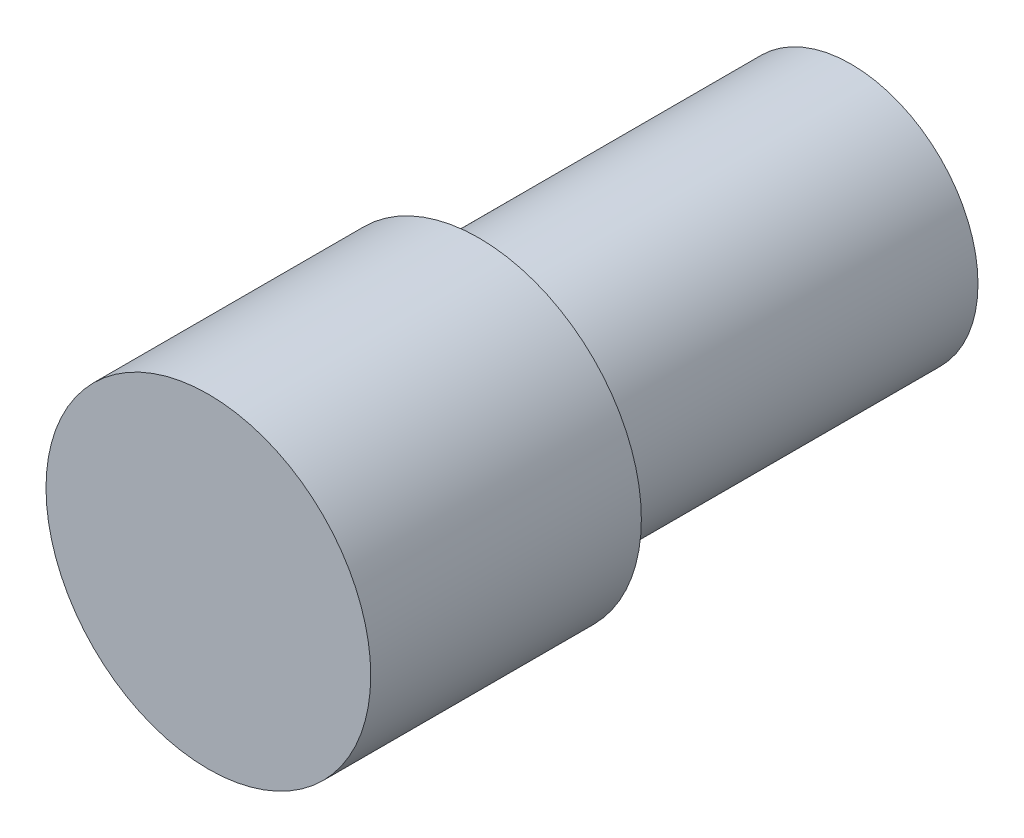
ISO-10303-21;
HEADER;
FILE_DESCRIPTION(('STEP AP214'),'2;1');
FILE_NAME('part.step','',(''),(''),'','','');
FILE_SCHEMA(('AUTOMOTIVE_DESIGN { 1 0 10303 214 1 1 1 1 }'));
ENDSEC;
DATA;
#1=APPLICATION_CONTEXT('core data for automotive mechanical design processes');
#2=APPLICATION_PROTOCOL_DEFINITION('international standard','automotive_design',2000,#1);
#3=PRODUCT_CONTEXT('',#1,'mechanical');
#4=PRODUCT('Part','Part','',(#3));
#5=PRODUCT_RELATED_PRODUCT_CATEGORY('part','',(#4));
#6=PRODUCT_DEFINITION_FORMATION('','',#4);
#7=PRODUCT_DEFINITION_CONTEXT('part definition',#1,'design');
#8=PRODUCT_DEFINITION('design','',#6,#7);
#9=PRODUCT_DEFINITION_SHAPE('','',#8);
#10=(LENGTH_UNIT() NAMED_UNIT(*) SI_UNIT(.MILLI.,.METRE.));
#11=(NAMED_UNIT(*) PLANE_ANGLE_UNIT() SI_UNIT($,.RADIAN.));
#12=(NAMED_UNIT(*) SI_UNIT($,.STERADIAN.) SOLID_ANGLE_UNIT());
#13=UNCERTAINTY_MEASURE_WITH_UNIT(LENGTH_MEASURE(1.E-05),#10,'distance_accuracy_value','');
#14=(GEOMETRIC_REPRESENTATION_CONTEXT(3) GLOBAL_UNCERTAINTY_ASSIGNED_CONTEXT((#13)) GLOBAL_UNIT_ASSIGNED_CONTEXT((#10,
#11,#12)) REPRESENTATION_CONTEXT('',''));
#15=CARTESIAN_POINT('',(0.,0.,0.));
#16=DIRECTION('',(0.,0.,1.));
#17=DIRECTION('',(1.,0.,0.));
#18=AXIS2_PLACEMENT_3D('',#15,#16,#17);
#19=CARTESIAN_POINT('',(0.,0.,0.));
#20=DIRECTION('',(0.,0.,1.));
#21=DIRECTION('',(1.,0.,0.));
#22=AXIS2_PLACEMENT_3D('',#19,#20,#21);
#23=PLANE('',#22);
#24=CARTESIAN_POINT('',(0.,0.,0.));
#25=DIRECTION('',(0.,0.,1.));
#26=DIRECTION('',(1.,0.,0.));
#27=AXIS2_PLACEMENT_3D('',#24,#25,#26);
#28=CIRCLE('',#27,6.);
#29=CARTESIAN_POINT('',(6.,0.,0.));
#30=VERTEX_POINT('',#29);
#31=EDGE_CURVE('E44',#30,#30,#28,.T.);
#32=ORIENTED_EDGE('',*,*,#31,.F.);
#33=EDGE_LOOP('',(#32));
#34=FACE_BOUND('',#33,.T.);
#35=CARTESIAN_POINT('',(0.,0.,0.));
#36=DIRECTION('',(0.,0.,1.));
#37=DIRECTION('',(1.,0.,0.));
#38=AXIS2_PLACEMENT_3D('',#35,#36,#37);
#39=CIRCLE('',#38,4.69);
#40=CARTESIAN_POINT('',(4.69,0.,0.));
#41=VERTEX_POINT('',#40);
#42=EDGE_CURVE('E10',#41,#41,#39,.F.);
#43=ORIENTED_EDGE('',*,*,#42,.F.);
#44=EDGE_LOOP('',(#43));
#45=FACE_BOUND('',#44,.T.);
#46=ADVANCED_FACE('F33',(#34,#45),#23,.F.);
#47=CARTESIAN_POINT('',(0.,0.,10.));
#48=DIRECTION('',(0.,0.,-1.));
#49=DIRECTION('',(-1.,0.,0.));
#50=AXIS2_PLACEMENT_3D('',#47,#48,#49);
#51=CYLINDRICAL_SURFACE('',#50,6.);
#52=CARTESIAN_POINT('',(0.,0.,10.));
#53=DIRECTION('',(0.,0.,1.));
#54=DIRECTION('',(1.,0.,0.));
#55=AXIS2_PLACEMENT_3D('',#52,#53,#54);
#56=CIRCLE('',#55,6.);
#57=CARTESIAN_POINT('',(6.,0.,10.));
#58=VERTEX_POINT('',#57);
#59=EDGE_CURVE('E40',#58,#58,#56,.T.);
#60=ORIENTED_EDGE('',*,*,#59,.F.);
#61=EDGE_LOOP('',(#60));
#62=FACE_BOUND('',#61,.T.);
#63=ORIENTED_EDGE('',*,*,#31,.T.);
#64=EDGE_LOOP('',(#63));
#65=FACE_BOUND('',#64,.T.);
#66=ADVANCED_FACE('F35',(#62,#65),#51,.T.);
#67=CARTESIAN_POINT('',(0.,0.,10.));
#68=DIRECTION('',(0.,0.,1.));
#69=DIRECTION('',(1.,0.,0.));
#70=AXIS2_PLACEMENT_3D('',#67,#68,#69);
#71=PLANE('',#70);
#72=ORIENTED_EDGE('',*,*,#59,.T.);
#73=EDGE_LOOP('',(#72));
#74=FACE_BOUND('',#73,.T.);
#75=ADVANCED_FACE('F76',(#74),#71,.T.);
#76=CARTESIAN_POINT('',(0.,0.,-13.75));
#77=DIRECTION('',(0.,0.,1.));
#78=DIRECTION('',(1.,0.,0.));
#79=AXIS2_PLACEMENT_3D('',#76,#77,#78);
#80=CYLINDRICAL_SURFACE('',#79,4.69);
#81=CARTESIAN_POINT('',(0.,0.,-13.75));
#82=DIRECTION('',(0.,0.,-1.));
#83=DIRECTION('',(-1.,0.,0.));
#84=AXIS2_PLACEMENT_3D('',#81,#82,#83);
#85=CIRCLE('',#84,4.69);
#86=CARTESIAN_POINT('',(-4.69,0.,-13.75));
#87=VERTEX_POINT('',#86);
#88=EDGE_CURVE('E49',#87,#87,#85,.T.);
#89=ORIENTED_EDGE('',*,*,#88,.F.);
#90=EDGE_LOOP('',(#89));
#91=FACE_BOUND('',#90,.T.);
#92=ORIENTED_EDGE('',*,*,#42,.T.);
#93=EDGE_LOOP('',(#92));
#94=FACE_BOUND('',#93,.T.);
#95=ADVANCED_FACE('F71',(#91,#94),#80,.T.);
#96=CARTESIAN_POINT('',(0.,0.,-13.75));
#97=DIRECTION('',(0.,0.,-1.));
#98=DIRECTION('',(-1.,0.,0.));
#99=AXIS2_PLACEMENT_3D('',#96,#97,#98);
#100=PLANE('',#99);
#101=CARTESIAN_POINT('',(0.,0.,-13.75));
#102=DIRECTION('',(0.,0.,-1.));
#103=DIRECTION('',(-1.,0.,0.));
#104=AXIS2_PLACEMENT_3D('',#101,#102,#103);
#105=CIRCLE('',#104,1.15);
#106=CARTESIAN_POINT('',(-1.15,0.,-13.75));
#107=VERTEX_POINT('',#106);
#108=EDGE_CURVE('E54',#107,#107,#105,.T.);
#109=ORIENTED_EDGE('',*,*,#108,.F.);
#110=EDGE_LOOP('',(#109));
#111=FACE_BOUND('',#110,.T.);
#112=ORIENTED_EDGE('',*,*,#88,.T.);
#113=EDGE_LOOP('',(#112));
#114=FACE_BOUND('',#113,.T.);
#115=ADVANCED_FACE('F65',(#111,#114),#100,.T.);
#116=CARTESIAN_POINT('',(0.,0.,0.));
#117=DIRECTION('',(0.,0.,-1.));
#118=DIRECTION('',(-1.,0.,0.));
#119=AXIS2_PLACEMENT_3D('',#116,#117,#118);
#120=CYLINDRICAL_SURFACE('',#119,1.15);
#121=CARTESIAN_POINT('',(0.,0.,0.));
#122=DIRECTION('',(0.,0.,-1.));
#123=DIRECTION('',(-1.,0.,0.));
#124=AXIS2_PLACEMENT_3D('',#121,#122,#123);
#125=CIRCLE('',#124,1.15);
#126=CARTESIAN_POINT('',(-1.15,0.,0.));
#127=VERTEX_POINT('',#126);
#128=EDGE_CURVE('E53',#127,#127,#125,.T.);
#129=ORIENTED_EDGE('',*,*,#128,.F.);
#130=EDGE_LOOP('',(#129));
#131=FACE_BOUND('',#130,.T.);
#132=ORIENTED_EDGE('',*,*,#108,.T.);
#133=EDGE_LOOP('',(#132));
#134=FACE_BOUND('',#133,.T.);
#135=ADVANCED_FACE('F62',(#131,#134),#120,.F.);
#136=CARTESIAN_POINT('',(0.,0.,0.));
#137=DIRECTION('',(0.,0.,-1.));
#138=DIRECTION('',(-1.,0.,0.));
#139=AXIS2_PLACEMENT_3D('',#136,#137,#138);
#140=PLANE('',#139);
#141=ORIENTED_EDGE('',*,*,#128,.T.);
#142=EDGE_LOOP('',(#141));
#143=FACE_BOUND('',#142,.T.);
#144=ADVANCED_FACE('F60',(#143),#140,.T.);
#145=CLOSED_SHELL('',(#46,#66,#75,#95,#115,#135,#144));
#146=MANIFOLD_SOLID_BREP('B2',#145);
#147=ADVANCED_BREP_SHAPE_REPRESENTATION('',(#18,#146),#14);
#148=SHAPE_DEFINITION_REPRESENTATION(#9,#147);
ENDSEC;
END-ISO-10303-21;
